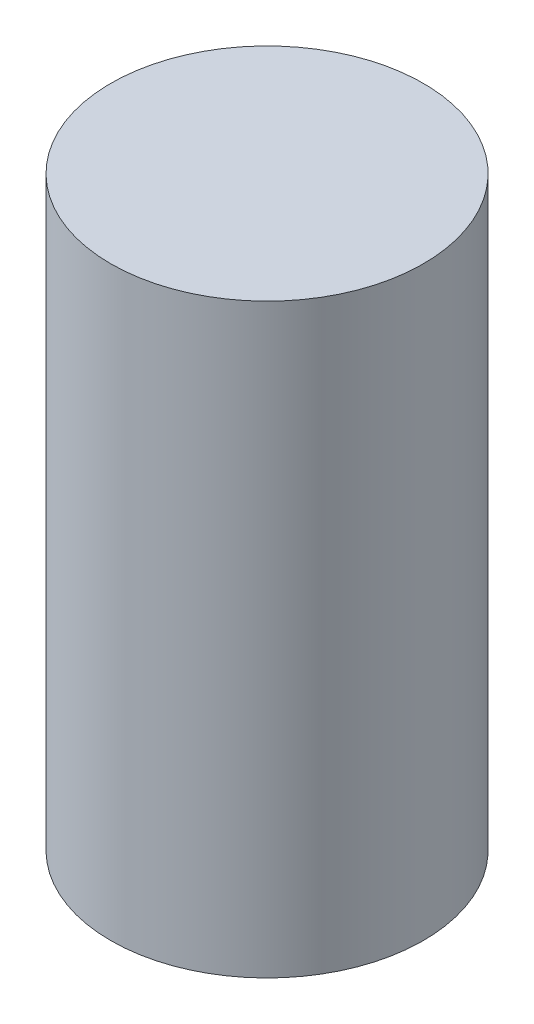
ISO-10303-21;
HEADER;
FILE_DESCRIPTION(('STEP AP214'),'2;1');
FILE_NAME('part.step','',(''),(''),'','','');
FILE_SCHEMA(('AUTOMOTIVE_DESIGN { 1 0 10303 214 1 1 1 1 }'));
ENDSEC;
DATA;
#1=APPLICATION_CONTEXT('core data for automotive mechanical design processes');
#2=APPLICATION_PROTOCOL_DEFINITION('international standard','automotive_design',2000,#1);
#3=PRODUCT_CONTEXT('',#1,'mechanical');
#4=PRODUCT('Part','Part','',(#3));
#5=PRODUCT_RELATED_PRODUCT_CATEGORY('part','',(#4));
#6=PRODUCT_DEFINITION_FORMATION('','',#4);
#7=PRODUCT_DEFINITION_CONTEXT('part definition',#1,'design');
#8=PRODUCT_DEFINITION('design','',#6,#7);
#9=PRODUCT_DEFINITION_SHAPE('','',#8);
#10=(LENGTH_UNIT() NAMED_UNIT(*) SI_UNIT(.MILLI.,.METRE.));
#11=(NAMED_UNIT(*) PLANE_ANGLE_UNIT() SI_UNIT($,.RADIAN.));
#12=(NAMED_UNIT(*) SI_UNIT($,.STERADIAN.) SOLID_ANGLE_UNIT());
#13=UNCERTAINTY_MEASURE_WITH_UNIT(LENGTH_MEASURE(1.E-05),#10,'distance_accuracy_value','');
#14=(GEOMETRIC_REPRESENTATION_CONTEXT(3) GLOBAL_UNCERTAINTY_ASSIGNED_CONTEXT((#13)) GLOBAL_UNIT_ASSIGNED_CONTEXT((#10,
#11,#12)) REPRESENTATION_CONTEXT('',''));
#15=CARTESIAN_POINT('',(0.,0.,0.));
#16=DIRECTION('',(0.,0.,1.));
#17=DIRECTION('',(1.,0.,0.));
#18=AXIS2_PLACEMENT_3D('',#15,#16,#17);
#19=CARTESIAN_POINT('',(0.,150.,0.));
#20=DIRECTION('',(0.,-1.,0.));
#21=DIRECTION('',(0.,0.,-1.));
#22=AXIS2_PLACEMENT_3D('',#19,#20,#21);
#23=CYLINDRICAL_SURFACE('',#22,40.);
#24=CARTESIAN_POINT('',(0.,150.,0.));
#25=DIRECTION('',(0.,1.,0.));
#26=DIRECTION('',(0.,0.,1.));
#27=AXIS2_PLACEMENT_3D('',#24,#25,#26);
#28=CIRCLE('',#27,40.);
#29=CARTESIAN_POINT('',(0.,150.,40.));
#30=VERTEX_POINT('',#29);
#31=EDGE_CURVE('E10',#30,#30,#28,.T.);
#32=ORIENTED_EDGE('',*,*,#31,.F.);
#33=EDGE_LOOP('',(#32));
#34=FACE_BOUND('',#33,.T.);
#35=CARTESIAN_POINT('',(0.,0.,0.));
#36=DIRECTION('',(0.,1.,0.));
#37=DIRECTION('',(0.,0.,1.));
#38=AXIS2_PLACEMENT_3D('',#35,#36,#37);
#39=CIRCLE('',#38,40.);
#40=CARTESIAN_POINT('',(0.,0.,40.));
#41=VERTEX_POINT('',#40);
#42=EDGE_CURVE('E40',#41,#41,#39,.T.);
#43=ORIENTED_EDGE('',*,*,#42,.T.);
#44=EDGE_LOOP('',(#43));
#45=FACE_BOUND('',#44,.T.);
#46=ADVANCED_FACE('F37',(#34,#45),#23,.T.);
#47=CARTESIAN_POINT('',(0.,150.,0.));
#48=DIRECTION('',(0.,1.,0.));
#49=DIRECTION('',(0.,0.,1.));
#50=AXIS2_PLACEMENT_3D('',#47,#48,#49);
#51=PLANE('',#50);
#52=ORIENTED_EDGE('',*,*,#31,.T.);
#53=EDGE_LOOP('',(#52));
#54=FACE_BOUND('',#53,.T.);
#55=ADVANCED_FACE('F52',(#54),#51,.T.);
#56=CARTESIAN_POINT('',(0.,0.,0.));
#57=DIRECTION('',(0.,1.,0.));
#58=DIRECTION('',(0.,0.,1.));
#59=AXIS2_PLACEMENT_3D('',#56,#57,#58);
#60=PLANE('',#59);
#61=ORIENTED_EDGE('',*,*,#42,.F.);
#62=EDGE_LOOP('',(#61));
#63=FACE_BOUND('',#62,.T.);
#64=ADVANCED_FACE('F50',(#63),#60,.F.);
#65=CLOSED_SHELL('',(#46,#55,#64));
#66=MANIFOLD_SOLID_BREP('B2',#65);
#67=ADVANCED_BREP_SHAPE_REPRESENTATION('',(#18,#66),#14);
#68=SHAPE_DEFINITION_REPRESENTATION(#9,#67);
ENDSEC;
END-ISO-10303-21;
